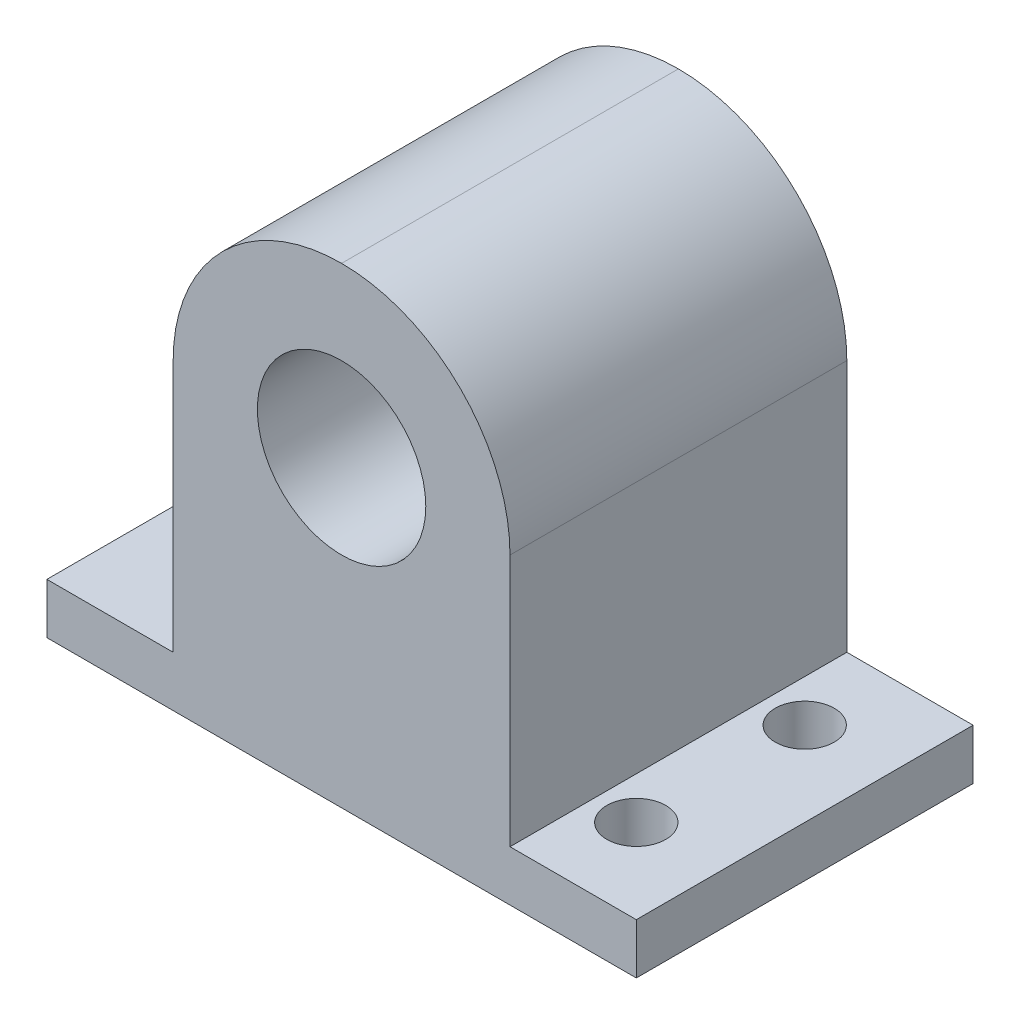
ISO-10303-21;
HEADER;
FILE_DESCRIPTION(('STEP AP214'),'2;1');
FILE_NAME('part.step','',(''),(''),'','','');
FILE_SCHEMA(('AUTOMOTIVE_DESIGN { 1 0 10303 214 1 1 1 1 }'));
ENDSEC;
DATA;
#1=APPLICATION_CONTEXT('core data for automotive mechanical design processes');
#2=APPLICATION_PROTOCOL_DEFINITION('international standard','automotive_design',2000,#1);
#3=PRODUCT_CONTEXT('',#1,'mechanical');
#4=PRODUCT('Part','Part','',(#3));
#5=PRODUCT_RELATED_PRODUCT_CATEGORY('part','',(#4));
#6=PRODUCT_DEFINITION_FORMATION('','',#4);
#7=PRODUCT_DEFINITION_CONTEXT('part definition',#1,'design');
#8=PRODUCT_DEFINITION('design','',#6,#7);
#9=PRODUCT_DEFINITION_SHAPE('','',#8);
#10=(LENGTH_UNIT() NAMED_UNIT(*) SI_UNIT(.MILLI.,.METRE.));
#11=(NAMED_UNIT(*) PLANE_ANGLE_UNIT() SI_UNIT($,.RADIAN.));
#12=(NAMED_UNIT(*) SI_UNIT($,.STERADIAN.) SOLID_ANGLE_UNIT());
#13=UNCERTAINTY_MEASURE_WITH_UNIT(LENGTH_MEASURE(1.E-05),#10,'distance_accuracy_value','');
#14=(GEOMETRIC_REPRESENTATION_CONTEXT(3) GLOBAL_UNCERTAINTY_ASSIGNED_CONTEXT((#13)) GLOBAL_UNIT_ASSIGNED_CONTEXT((#10,
#11,#12)) REPRESENTATION_CONTEXT('',''));
#15=CARTESIAN_POINT('',(0.,0.,0.));
#16=DIRECTION('',(0.,0.,1.));
#17=DIRECTION('',(1.,0.,0.));
#18=AXIS2_PLACEMENT_3D('',#15,#16,#17);
#19=CARTESIAN_POINT('',(0.,0.,20.));
#20=DIRECTION('',(0.,1.,0.));
#21=DIRECTION('',(0.,0.,1.));
#22=AXIS2_PLACEMENT_3D('',#19,#20,#21);
#23=PLANE('',#22);
#24=CARTESIAN_POINT('',(30.,0.,5.));
#25=DIRECTION('',(0.,1.,0.));
#26=DIRECTION('',(0.,0.,1.));
#27=AXIS2_PLACEMENT_3D('',#24,#25,#26);
#28=CIRCLE('',#27,1.75000000000001);
#29=CARTESIAN_POINT('',(30.,0.,6.75000000000001));
#30=VERTEX_POINT('',#29);
#31=EDGE_CURVE('E293',#30,#30,#28,.F.);
#32=ORIENTED_EDGE('',*,*,#31,.F.);
#33=EDGE_LOOP('',(#32));
#34=FACE_BOUND('',#33,.T.);
#35=CARTESIAN_POINT('',(5.,0.,15.));
#36=DIRECTION('',(0.,1.,0.));
#37=DIRECTION('',(0.,0.,1.));
#38=AXIS2_PLACEMENT_3D('',#35,#36,#37);
#39=CIRCLE('',#38,1.75);
#40=CARTESIAN_POINT('',(5.,0.,16.75));
#41=VERTEX_POINT('',#40);
#42=EDGE_CURVE('E290',#41,#41,#39,.F.);
#43=ORIENTED_EDGE('',*,*,#42,.F.);
#44=EDGE_LOOP('',(#43));
#45=FACE_BOUND('',#44,.T.);
#46=CARTESIAN_POINT('',(5.,0.,5.));
#47=DIRECTION('',(0.,1.,0.));
#48=DIRECTION('',(0.,0.,1.));
#49=AXIS2_PLACEMENT_3D('',#46,#47,#48);
#50=CIRCLE('',#49,1.75);
#51=CARTESIAN_POINT('',(5.,0.,6.75));
#52=VERTEX_POINT('',#51);
#53=EDGE_CURVE('E287',#52,#52,#50,.F.);
#54=ORIENTED_EDGE('',*,*,#53,.F.);
#55=EDGE_LOOP('',(#54));
#56=FACE_BOUND('',#55,.T.);
#57=CARTESIAN_POINT('',(30.,0.,15.));
#58=DIRECTION('',(0.,1.,0.));
#59=DIRECTION('',(0.,0.,1.));
#60=AXIS2_PLACEMENT_3D('',#57,#58,#59);
#61=CIRCLE('',#60,1.75000000000001);
#62=CARTESIAN_POINT('',(30.,0.,16.75));
#63=VERTEX_POINT('',#62);
#64=EDGE_CURVE('E307',#63,#63,#61,.F.);
#65=ORIENTED_EDGE('',*,*,#64,.F.);
#66=EDGE_LOOP('',(#65));
#67=FACE_BOUND('',#66,.T.);
#68=DIRECTION('',(1.,0.,0.));
#69=VECTOR('',#68,1.);
#70=CARTESIAN_POINT('',(0.,0.,0.));
#71=LINE('',#70,#69);
#72=CARTESIAN_POINT('',(0.,0.,0.));
#73=VERTEX_POINT('',#72);
#74=CARTESIAN_POINT('',(35.,0.,0.));
#75=VERTEX_POINT('',#74);
#76=EDGE_CURVE('E161',#73,#75,#71,.T.);
#77=ORIENTED_EDGE('',*,*,#76,.T.);
#78=DIRECTION('',(0.,0.,-1.));
#79=VECTOR('',#78,1.);
#80=CARTESIAN_POINT('',(35.,0.,20.));
#81=LINE('',#80,#79);
#82=CARTESIAN_POINT('',(35.,0.,20.));
#83=VERTEX_POINT('',#82);
#84=EDGE_CURVE('E143',#83,#75,#81,.T.);
#85=ORIENTED_EDGE('',*,*,#84,.F.);
#86=DIRECTION('',(1.,0.,0.));
#87=VECTOR('',#86,1.);
#88=CARTESIAN_POINT('',(0.,0.,20.));
#89=LINE('',#88,#87);
#90=CARTESIAN_POINT('',(0.,0.,20.));
#91=VERTEX_POINT('',#90);
#92=EDGE_CURVE('E149',#91,#83,#89,.T.);
#93=ORIENTED_EDGE('',*,*,#92,.F.);
#94=DIRECTION('',(0.,0.,-1.));
#95=VECTOR('',#94,1.);
#96=CARTESIAN_POINT('',(0.,0.,20.));
#97=LINE('',#96,#95);
#98=EDGE_CURVE('E211',#91,#73,#97,.T.);
#99=ORIENTED_EDGE('',*,*,#98,.T.);
#100=EDGE_LOOP('',(#77,#85,#93,#99));
#101=FACE_BOUND('',#100,.T.);
#102=ADVANCED_FACE('F67',(#34,#45,#56,#67,#101),#23,.F.);
#103=CARTESIAN_POINT('',(35.,0.,20.));
#104=DIRECTION('',(-1.,0.,0.));
#105=DIRECTION('',(0.,0.,1.));
#106=AXIS2_PLACEMENT_3D('',#103,#104,#105);
#107=PLANE('',#106);
#108=DIRECTION('',(0.,1.,0.));
#109=VECTOR('',#108,1.);
#110=CARTESIAN_POINT('',(35.,0.,0.));
#111=LINE('',#110,#109);
#112=CARTESIAN_POINT('',(35.,3.,0.));
#113=VERTEX_POINT('',#112);
#114=EDGE_CURVE('E215',#75,#113,#111,.T.);
#115=ORIENTED_EDGE('',*,*,#114,.T.);
#116=DIRECTION('',(0.,0.,-1.));
#117=VECTOR('',#116,1.);
#118=CARTESIAN_POINT('',(35.,3.,20.));
#119=LINE('',#118,#117);
#120=CARTESIAN_POINT('',(35.,3.,20.));
#121=VERTEX_POINT('',#120);
#122=EDGE_CURVE('E146',#121,#113,#119,.T.);
#123=ORIENTED_EDGE('',*,*,#122,.F.);
#124=DIRECTION('',(0.,1.,0.));
#125=VECTOR('',#124,1.);
#126=CARTESIAN_POINT('',(35.,0.,20.));
#127=LINE('',#126,#125);
#128=EDGE_CURVE('E138',#83,#121,#127,.T.);
#129=ORIENTED_EDGE('',*,*,#128,.F.);
#130=ORIENTED_EDGE('',*,*,#84,.T.);
#131=EDGE_LOOP('',(#115,#123,#129,#130));
#132=FACE_BOUND('',#131,.T.);
#133=ADVANCED_FACE('F141',(#132),#107,.F.);
#134=CARTESIAN_POINT('',(0.,0.,20.));
#135=DIRECTION('',(-1.,0.,0.));
#136=DIRECTION('',(0.,0.,1.));
#137=AXIS2_PLACEMENT_3D('',#134,#135,#136);
#138=PLANE('',#137);
#139=DIRECTION('',(0.,1.,0.));
#140=VECTOR('',#139,1.);
#141=CARTESIAN_POINT('',(0.,0.,0.));
#142=LINE('',#141,#140);
#143=CARTESIAN_POINT('',(0.,3.,0.));
#144=VERTEX_POINT('',#143);
#145=EDGE_CURVE('E158',#73,#144,#142,.T.);
#146=ORIENTED_EDGE('',*,*,#145,.F.);
#147=ORIENTED_EDGE('',*,*,#98,.F.);
#148=DIRECTION('',(0.,1.,0.));
#149=VECTOR('',#148,1.);
#150=CARTESIAN_POINT('',(0.,0.,20.));
#151=LINE('',#150,#149);
#152=CARTESIAN_POINT('',(0.,3.,20.));
#153=VERTEX_POINT('',#152);
#154=EDGE_CURVE('E156',#91,#153,#151,.T.);
#155=ORIENTED_EDGE('',*,*,#154,.T.);
#156=DIRECTION('',(0.,0.,-1.));
#157=VECTOR('',#156,1.);
#158=CARTESIAN_POINT('',(0.,3.,20.));
#159=LINE('',#158,#157);
#160=EDGE_CURVE('E166',#153,#144,#159,.T.);
#161=ORIENTED_EDGE('',*,*,#160,.T.);
#162=EDGE_LOOP('',(#146,#147,#155,#161));
#163=FACE_BOUND('',#162,.T.);
#164=ADVANCED_FACE('F224',(#163),#138,.T.);
#165=CARTESIAN_POINT('',(0.,0.,0.));
#166=DIRECTION('',(0.,0.,1.));
#167=DIRECTION('',(1.,0.,0.));
#168=AXIS2_PLACEMENT_3D('',#165,#166,#167);
#169=PLANE('',#168);
#170=CARTESIAN_POINT('',(17.5,18.,0.));
#171=DIRECTION('',(0.,0.,1.));
#172=DIRECTION('',(1.,0.,0.));
#173=AXIS2_PLACEMENT_3D('',#170,#171,#172);
#174=CIRCLE('',#173,5.);
#175=CARTESIAN_POINT('',(22.5,18.,0.));
#176=VERTEX_POINT('',#175);
#177=EDGE_CURVE('E179',#176,#176,#174,.F.);
#178=ORIENTED_EDGE('',*,*,#177,.F.);
#179=EDGE_LOOP('',(#178));
#180=FACE_BOUND('',#179,.T.);
#181=DIRECTION('',(0.,1.,0.));
#182=VECTOR('',#181,1.);
#183=CARTESIAN_POINT('',(7.5,3.,0.));
#184=LINE('',#183,#182);
#185=CARTESIAN_POINT('',(7.5,3.,0.));
#186=VERTEX_POINT('',#185);
#187=CARTESIAN_POINT('',(7.5,18.,0.));
#188=VERTEX_POINT('',#187);
#189=EDGE_CURVE('E176',#186,#188,#184,.T.);
#190=ORIENTED_EDGE('',*,*,#189,.T.);
#191=CARTESIAN_POINT('',(17.5,18.,0.));
#192=DIRECTION('',(0.,0.,1.));
#193=DIRECTION('',(1.,0.,0.));
#194=AXIS2_PLACEMENT_3D('',#191,#192,#193);
#195=CIRCLE('',#194,10.);
#196=CARTESIAN_POINT('',(17.5,28.,0.));
#197=VERTEX_POINT('',#196);
#198=EDGE_CURVE('E75',#188,#197,#195,.F.);
#199=ORIENTED_EDGE('',*,*,#198,.T.);
#200=CARTESIAN_POINT('',(17.5,18.,0.));
#201=DIRECTION('',(0.,0.,1.));
#202=DIRECTION('',(1.,0.,0.));
#203=AXIS2_PLACEMENT_3D('',#200,#201,#202);
#204=CIRCLE('',#203,10.);
#205=CARTESIAN_POINT('',(27.5,18.,0.));
#206=VERTEX_POINT('',#205);
#207=EDGE_CURVE('E185',#197,#206,#204,.F.);
#208=ORIENTED_EDGE('',*,*,#207,.T.);
#209=DIRECTION('',(0.,1.,0.));
#210=VECTOR('',#209,1.);
#211=CARTESIAN_POINT('',(27.5,3.,0.));
#212=LINE('',#211,#210);
#213=CARTESIAN_POINT('',(27.5,3.,0.));
#214=VERTEX_POINT('',#213);
#215=EDGE_CURVE('E173',#214,#206,#212,.T.);
#216=ORIENTED_EDGE('',*,*,#215,.F.);
#217=DIRECTION('',(1.,0.,0.));
#218=VECTOR('',#217,1.);
#219=CARTESIAN_POINT('',(0.,3.,0.));
#220=LINE('',#219,#218);
#221=EDGE_CURVE('E217',#214,#113,#220,.T.);
#222=ORIENTED_EDGE('',*,*,#221,.T.);
#223=ORIENTED_EDGE('',*,*,#114,.F.);
#224=ORIENTED_EDGE('',*,*,#76,.F.);
#225=ORIENTED_EDGE('',*,*,#145,.T.);
#226=EDGE_CURVE('E218',#144,#186,#220,.T.);
#227=ORIENTED_EDGE('',*,*,#226,.T.);
#228=EDGE_LOOP('',(#190,#199,#208,#216,#222,#223,#224,#225,#227));
#229=FACE_BOUND('',#228,.T.);
#230=ADVANCED_FACE('F194',(#180,#229),#169,.F.);
#231=CARTESIAN_POINT('',(0.,0.,20.));
#232=DIRECTION('',(0.,0.,1.));
#233=DIRECTION('',(1.,0.,0.));
#234=AXIS2_PLACEMENT_3D('',#231,#232,#233);
#235=PLANE('',#234);
#236=CARTESIAN_POINT('',(17.5,18.,20.));
#237=DIRECTION('',(0.,0.,1.));
#238=DIRECTION('',(1.,0.,0.));
#239=AXIS2_PLACEMENT_3D('',#236,#237,#238);
#240=CIRCLE('',#239,5.);
#241=CARTESIAN_POINT('',(22.5,18.,20.));
#242=VERTEX_POINT('',#241);
#243=EDGE_CURVE('E310',#242,#242,#240,.T.);
#244=ORIENTED_EDGE('',*,*,#243,.F.);
#245=EDGE_LOOP('',(#244));
#246=FACE_BOUND('',#245,.T.);
#247=CARTESIAN_POINT('',(17.5,18.,20.));
#248=DIRECTION('',(0.,0.,1.));
#249=DIRECTION('',(1.,0.,0.));
#250=AXIS2_PLACEMENT_3D('',#247,#248,#249);
#251=CIRCLE('',#250,10.);
#252=CARTESIAN_POINT('',(27.5,18.,20.));
#253=VERTEX_POINT('',#252);
#254=CARTESIAN_POINT('',(17.5,28.,20.));
#255=VERTEX_POINT('',#254);
#256=EDGE_CURVE('E189',#253,#255,#251,.T.);
#257=ORIENTED_EDGE('',*,*,#256,.T.);
#258=CARTESIAN_POINT('',(17.5,18.,20.));
#259=DIRECTION('',(0.,0.,1.));
#260=DIRECTION('',(1.,0.,0.));
#261=AXIS2_PLACEMENT_3D('',#258,#259,#260);
#262=CIRCLE('',#261,10.);
#263=CARTESIAN_POINT('',(7.5,18.,20.));
#264=VERTEX_POINT('',#263);
#265=EDGE_CURVE('E12',#255,#264,#262,.T.);
#266=ORIENTED_EDGE('',*,*,#265,.T.);
#267=DIRECTION('',(0.,1.,0.));
#268=VECTOR('',#267,1.);
#269=CARTESIAN_POINT('',(7.5,3.,20.));
#270=LINE('',#269,#268);
#271=CARTESIAN_POINT('',(7.5,3.,20.));
#272=VERTEX_POINT('',#271);
#273=EDGE_CURVE('E170',#272,#264,#270,.T.);
#274=ORIENTED_EDGE('',*,*,#273,.F.);
#275=DIRECTION('',(1.,0.,0.));
#276=VECTOR('',#275,1.);
#277=CARTESIAN_POINT('',(0.,3.,20.));
#278=LINE('',#277,#276);
#279=EDGE_CURVE('E206',#153,#272,#278,.T.);
#280=ORIENTED_EDGE('',*,*,#279,.F.);
#281=ORIENTED_EDGE('',*,*,#154,.F.);
#282=ORIENTED_EDGE('',*,*,#92,.T.);
#283=ORIENTED_EDGE('',*,*,#128,.T.);
#284=CARTESIAN_POINT('',(27.5,3.,20.));
#285=VERTEX_POINT('',#284);
#286=EDGE_CURVE('E148',#285,#121,#278,.T.);
#287=ORIENTED_EDGE('',*,*,#286,.F.);
#288=DIRECTION('',(0.,1.,0.));
#289=VECTOR('',#288,1.);
#290=CARTESIAN_POINT('',(27.5,3.,20.));
#291=LINE('',#290,#289);
#292=EDGE_CURVE('E172',#285,#253,#291,.T.);
#293=ORIENTED_EDGE('',*,*,#292,.T.);
#294=EDGE_LOOP('',(#257,#266,#274,#280,#281,#282,#283,#287,#293));
#295=FACE_BOUND('',#294,.T.);
#296=ADVANCED_FACE('F153',(#246,#295),#235,.T.);
#297=CARTESIAN_POINT('',(0.,3.,20.));
#298=DIRECTION('',(0.,1.,0.));
#299=DIRECTION('',(0.,0.,1.));
#300=AXIS2_PLACEMENT_3D('',#297,#298,#299);
#301=PLANE('',#300);
#302=CARTESIAN_POINT('',(5.,3.,15.));
#303=DIRECTION('',(0.,1.,0.));
#304=DIRECTION('',(0.,0.,1.));
#305=AXIS2_PLACEMENT_3D('',#302,#303,#304);
#306=CIRCLE('',#305,1.75);
#307=CARTESIAN_POINT('',(5.,3.,16.75));
#308=VERTEX_POINT('',#307);
#309=EDGE_CURVE('E297',#308,#308,#306,.T.);
#310=ORIENTED_EDGE('',*,*,#309,.F.);
#311=EDGE_LOOP('',(#310));
#312=FACE_BOUND('',#311,.T.);
#313=CARTESIAN_POINT('',(5.,3.,5.));
#314=DIRECTION('',(0.,1.,0.));
#315=DIRECTION('',(0.,0.,1.));
#316=AXIS2_PLACEMENT_3D('',#313,#314,#315);
#317=CIRCLE('',#316,1.75);
#318=CARTESIAN_POINT('',(5.,3.,6.75));
#319=VERTEX_POINT('',#318);
#320=EDGE_CURVE('E284',#319,#319,#317,.T.);
#321=ORIENTED_EDGE('',*,*,#320,.F.);
#322=EDGE_LOOP('',(#321));
#323=FACE_BOUND('',#322,.T.);
#324=ORIENTED_EDGE('',*,*,#279,.T.);
#325=DIRECTION('',(0.,0.,-1.));
#326=VECTOR('',#325,1.);
#327=CARTESIAN_POINT('',(7.5,3.,20.));
#328=LINE('',#327,#326);
#329=EDGE_CURVE('E162',#272,#186,#328,.T.);
#330=ORIENTED_EDGE('',*,*,#329,.T.);
#331=ORIENTED_EDGE('',*,*,#226,.F.);
#332=ORIENTED_EDGE('',*,*,#160,.F.);
#333=EDGE_LOOP('',(#324,#330,#331,#332));
#334=FACE_BOUND('',#333,.T.);
#335=ADVANCED_FACE('F208',(#312,#323,#334),#301,.T.);
#336=CARTESIAN_POINT('',(30.,3.,5.));
#337=DIRECTION('',(0.,1.,0.));
#338=DIRECTION('',(0.,0.,1.));
#339=AXIS2_PLACEMENT_3D('',#336,#337,#338);
#340=CIRCLE('',#339,1.75000000000001);
#341=CARTESIAN_POINT('',(30.,3.,6.75000000000001));
#342=VERTEX_POINT('',#341);
#343=EDGE_CURVE('E296',#342,#342,#340,.T.);
#344=ORIENTED_EDGE('',*,*,#343,.F.);
#345=EDGE_LOOP('',(#344));
#346=FACE_BOUND('',#345,.T.);
#347=CARTESIAN_POINT('',(30.,3.,15.));
#348=DIRECTION('',(0.,1.,0.));
#349=DIRECTION('',(0.,0.,1.));
#350=AXIS2_PLACEMENT_3D('',#347,#348,#349);
#351=CIRCLE('',#350,1.75000000000001);
#352=CARTESIAN_POINT('',(30.,3.,16.75));
#353=VERTEX_POINT('',#352);
#354=EDGE_CURVE('E300',#353,#353,#351,.T.);
#355=ORIENTED_EDGE('',*,*,#354,.F.);
#356=EDGE_LOOP('',(#355));
#357=FACE_BOUND('',#356,.T.);
#358=DIRECTION('',(0.,0.,-1.));
#359=VECTOR('',#358,1.);
#360=CARTESIAN_POINT('',(27.5,3.,20.));
#361=LINE('',#360,#359);
#362=EDGE_CURVE('E164',#285,#214,#361,.T.);
#363=ORIENTED_EDGE('',*,*,#362,.F.);
#364=ORIENTED_EDGE('',*,*,#286,.T.);
#365=ORIENTED_EDGE('',*,*,#122,.T.);
#366=ORIENTED_EDGE('',*,*,#221,.F.);
#367=EDGE_LOOP('',(#363,#364,#365,#366));
#368=FACE_BOUND('',#367,.T.);
#369=ADVANCED_FACE('F227',(#346,#357,#368),#301,.T.);
#370=CARTESIAN_POINT('',(7.5,3.,20.));
#371=DIRECTION('',(-1.,0.,0.));
#372=DIRECTION('',(0.,0.,1.));
#373=AXIS2_PLACEMENT_3D('',#370,#371,#372);
#374=PLANE('',#373);
#375=ORIENTED_EDGE('',*,*,#273,.T.);
#376=DIRECTION('',(0.,0.,-1.));
#377=VECTOR('',#376,1.);
#378=CARTESIAN_POINT('',(7.5,18.,20.));
#379=LINE('',#378,#377);
#380=EDGE_CURVE('E191',#264,#188,#379,.T.);
#381=ORIENTED_EDGE('',*,*,#380,.T.);
#382=ORIENTED_EDGE('',*,*,#189,.F.);
#383=ORIENTED_EDGE('',*,*,#329,.F.);
#384=EDGE_LOOP('',(#375,#381,#382,#383));
#385=FACE_BOUND('',#384,.T.);
#386=ADVANCED_FACE('F204',(#385),#374,.T.);
#387=CARTESIAN_POINT('',(27.5,3.,20.));
#388=DIRECTION('',(-1.,0.,0.));
#389=DIRECTION('',(0.,0.,1.));
#390=AXIS2_PLACEMENT_3D('',#387,#388,#389);
#391=PLANE('',#390);
#392=ORIENTED_EDGE('',*,*,#215,.T.);
#393=DIRECTION('',(0.,0.,-1.));
#394=VECTOR('',#393,1.);
#395=CARTESIAN_POINT('',(27.5,18.,20.));
#396=LINE('',#395,#394);
#397=EDGE_CURVE('E187',#206,#253,#396,.F.);
#398=ORIENTED_EDGE('',*,*,#397,.T.);
#399=ORIENTED_EDGE('',*,*,#292,.F.);
#400=ORIENTED_EDGE('',*,*,#362,.T.);
#401=EDGE_LOOP('',(#392,#398,#399,#400));
#402=FACE_BOUND('',#401,.T.);
#403=ADVANCED_FACE('F230',(#402),#391,.F.);
#404=CARTESIAN_POINT('',(17.5,18.,20.));
#405=DIRECTION('',(0.,0.,1.));
#406=DIRECTION('',(1.,0.,0.));
#407=AXIS2_PLACEMENT_3D('',#404,#405,#406);
#408=CYLINDRICAL_SURFACE('',#407,10.);
#409=ORIENTED_EDGE('',*,*,#256,.F.);
#410=ORIENTED_EDGE('',*,*,#397,.F.);
#411=ORIENTED_EDGE('',*,*,#207,.F.);
#412=DIRECTION('',(0.,0.,-1.));
#413=VECTOR('',#412,1.);
#414=CARTESIAN_POINT('',(17.5,28.,0.));
#415=LINE('',#414,#413);
#416=EDGE_CURVE('E183',#255,#197,#415,.T.);
#417=ORIENTED_EDGE('',*,*,#416,.F.);
#418=EDGE_LOOP('',(#409,#410,#411,#417));
#419=FACE_BOUND('',#418,.T.);
#420=ADVANCED_FACE('F202',(#419),#408,.T.);
#421=CARTESIAN_POINT('',(17.5,18.,20.));
#422=DIRECTION('',(0.,0.,-1.));
#423=DIRECTION('',(-1.,0.,0.));
#424=AXIS2_PLACEMENT_3D('',#421,#422,#423);
#425=CYLINDRICAL_SURFACE('',#424,10.);
#426=ORIENTED_EDGE('',*,*,#265,.F.);
#427=ORIENTED_EDGE('',*,*,#416,.T.);
#428=ORIENTED_EDGE('',*,*,#198,.F.);
#429=ORIENTED_EDGE('',*,*,#380,.F.);
#430=EDGE_LOOP('',(#426,#427,#428,#429));
#431=FACE_BOUND('',#430,.T.);
#432=ADVANCED_FACE('F69',(#431),#425,.T.);
#433=CARTESIAN_POINT('',(17.5,18.,-0.001000000000001));
#434=DIRECTION('',(0.,0.,1.));
#435=DIRECTION('',(1.,0.,0.));
#436=AXIS2_PLACEMENT_3D('',#433,#434,#435);
#437=CYLINDRICAL_SURFACE('',#436,5.);
#438=ORIENTED_EDGE('',*,*,#243,.T.);
#439=EDGE_LOOP('',(#438));
#440=FACE_BOUND('',#439,.T.);
#441=ORIENTED_EDGE('',*,*,#177,.T.);
#442=EDGE_LOOP('',(#441));
#443=FACE_BOUND('',#442,.T.);
#444=ADVANCED_FACE('F261',(#440,#443),#437,.F.);
#445=CARTESIAN_POINT('',(30.,-0.00100000000000013,15.));
#446=DIRECTION('',(0.,1.,0.));
#447=DIRECTION('',(0.,0.,1.));
#448=AXIS2_PLACEMENT_3D('',#445,#446,#447);
#449=CYLINDRICAL_SURFACE('',#448,1.75000000000001);
#450=CARTESIAN_POINT('',(30.,3.,16.75));
#451=CARTESIAN_POINT('',(30.,2.96875,16.75));
#452=CARTESIAN_POINT('',(30.,2.9375,16.75));
#453=CARTESIAN_POINT('',(30.,2.875,16.75));
#454=CARTESIAN_POINT('',(30.,2.84375,16.75));
#455=CARTESIAN_POINT('',(30.,2.78125,16.75));
#456=CARTESIAN_POINT('',(30.,2.75,16.75));
#457=CARTESIAN_POINT('',(30.,2.6875,16.75));
#458=CARTESIAN_POINT('',(30.,2.65625,16.75));
#459=CARTESIAN_POINT('',(30.,2.59375,16.75));
#460=CARTESIAN_POINT('',(30.,2.5625,16.75));
#461=CARTESIAN_POINT('',(30.,2.5,16.75));
#462=CARTESIAN_POINT('',(30.,2.46875,16.75));
#463=CARTESIAN_POINT('',(30.,2.40625,16.75));
#464=CARTESIAN_POINT('',(30.,2.375,16.75));
#465=CARTESIAN_POINT('',(30.,2.3125,16.75));
#466=CARTESIAN_POINT('',(30.,2.28125,16.75));
#467=CARTESIAN_POINT('',(30.,2.21875,16.75));
#468=CARTESIAN_POINT('',(30.,2.1875,16.75));
#469=CARTESIAN_POINT('',(30.,2.125,16.75));
#470=CARTESIAN_POINT('',(30.,2.09375,16.75));
#471=CARTESIAN_POINT('',(30.,2.03125,16.75));
#472=CARTESIAN_POINT('',(30.,2.,16.75));
#473=CARTESIAN_POINT('',(30.,1.9375,16.75));
#474=CARTESIAN_POINT('',(30.,1.90625,16.75));
#475=CARTESIAN_POINT('',(30.,1.84375,16.75));
#476=CARTESIAN_POINT('',(30.,1.8125,16.75));
#477=CARTESIAN_POINT('',(30.,1.75,16.75));
#478=CARTESIAN_POINT('',(30.,1.71875,16.75));
#479=CARTESIAN_POINT('',(30.,1.65625,16.75));
#480=CARTESIAN_POINT('',(30.,1.625,16.75));
#481=CARTESIAN_POINT('',(30.,1.5625,16.75));
#482=CARTESIAN_POINT('',(30.,1.53125,16.75));
#483=CARTESIAN_POINT('',(30.,1.46875,16.75));
#484=CARTESIAN_POINT('',(30.,1.4375,16.75));
#485=CARTESIAN_POINT('',(30.,1.375,16.75));
#486=CARTESIAN_POINT('',(30.,1.34375,16.75));
#487=CARTESIAN_POINT('',(30.,1.28125,16.75));
#488=CARTESIAN_POINT('',(30.,1.25,16.75));
#489=CARTESIAN_POINT('',(30.,1.1875,16.75));
#490=CARTESIAN_POINT('',(30.,1.15625,16.75));
#491=CARTESIAN_POINT('',(30.,1.09375,16.75));
#492=CARTESIAN_POINT('',(30.,1.0625,16.75));
#493=CARTESIAN_POINT('',(30.,1.,16.75));
#494=CARTESIAN_POINT('',(30.,0.96875,16.75));
#495=CARTESIAN_POINT('',(30.,0.90625,16.75));
#496=CARTESIAN_POINT('',(30.,0.875,16.75));
#497=CARTESIAN_POINT('',(30.,0.8125,16.75));
#498=CARTESIAN_POINT('',(30.,0.78125,16.75));
#499=CARTESIAN_POINT('',(30.,0.71875,16.75));
#500=CARTESIAN_POINT('',(30.,0.6875,16.75));
#501=CARTESIAN_POINT('',(30.,0.625,16.75));
#502=CARTESIAN_POINT('',(30.,0.59375,16.75));
#503=CARTESIAN_POINT('',(30.,0.53125,16.75));
#504=CARTESIAN_POINT('',(30.,0.5,16.75));
#505=CARTESIAN_POINT('',(30.,0.4375,16.75));
#506=CARTESIAN_POINT('',(30.,0.40625,16.75));
#507=CARTESIAN_POINT('',(30.,0.34375,16.75));
#508=CARTESIAN_POINT('',(30.,0.3125,16.75));
#509=CARTESIAN_POINT('',(30.,0.25,16.75));
#510=CARTESIAN_POINT('',(30.,0.21875,16.75));
#511=CARTESIAN_POINT('',(30.,0.15625,16.75));
#512=CARTESIAN_POINT('',(30.,0.125,16.75));
#513=CARTESIAN_POINT('',(30.,0.0625000000000001,16.75));
#514=CARTESIAN_POINT('',(30.,0.0312500000000001,16.75));
#515=CARTESIAN_POINT('',(30.,0.,16.75));
#516=B_SPLINE_CURVE_WITH_KNOTS('',3,(#450,#451,#452,#453,#454,#455,#456,#457,#458,#459,#460,
#461,#462,#463,#464,#465,#466,#467,#468,#469,#470,#471,#472,#473,#474,#475,#476,#477,#478,#479,
#480,#481,#482,#483,#484,#485,#486,#487,#488,#489,#490,#491,#492,#493,#494,#495,#496,#497,#498,
#499,#500,#501,#502,#503,#504,#505,#506,#507,#508,#509,#510,#511,#512,#513,#514,#515),
.UNSPECIFIED.,.F.,.F.,(4,2,2,2,2,2,2,2,2,2,2,2,2,2,2,2,2,2,2,2,2,2,2,2,2,2,2,2,2,2,2,2,4),(0.,
0.0937500000000001,0.1875,0.28125,0.375,0.46875,0.5625,0.65625,0.75,0.84375,0.9375,1.03125,
1.125,1.21875,1.3125,1.40625,1.5,1.59375,1.6875,1.78125,1.875,1.96875,2.0625,2.15625,2.25,
2.34375,2.4375,2.53125,2.625,2.71875,2.8125,2.90625,3.),.UNSPECIFIED.);
#517=EDGE_CURVE('BSEAM263',#353,#63,#516,.T.);
#518=ORIENTED_EDGE('',*,*,#354,.T.);
#519=ORIENTED_EDGE('',*,*,#64,.T.);
#520=ORIENTED_EDGE('',*,*,#517,.T.);
#521=ORIENTED_EDGE('',*,*,#517,.F.);
#522=EDGE_LOOP('',(#518,#520,#519,#521));
#523=FACE_BOUND('',#522,.T.);
#524=ADVANCED_FACE('F263',(#523),#449,.F.);
#525=CARTESIAN_POINT('',(30.,-0.00100000000000013,5.));
#526=DIRECTION('',(0.,1.,0.));
#527=DIRECTION('',(0.,0.,1.));
#528=AXIS2_PLACEMENT_3D('',#525,#526,#527);
#529=CYLINDRICAL_SURFACE('',#528,1.75000000000001);
#530=CARTESIAN_POINT('',(30.,3.,6.75000000000001));
#531=CARTESIAN_POINT('',(30.,2.96875,6.75000000000001));
#532=CARTESIAN_POINT('',(30.,2.9375,6.75000000000001));
#533=CARTESIAN_POINT('',(30.,2.875,6.75000000000001));
#534=CARTESIAN_POINT('',(30.,2.84375,6.75000000000001));
#535=CARTESIAN_POINT('',(30.,2.78125,6.75000000000001));
#536=CARTESIAN_POINT('',(30.,2.75,6.75000000000001));
#537=CARTESIAN_POINT('',(30.,2.6875,6.75000000000001));
#538=CARTESIAN_POINT('',(30.,2.65625,6.75000000000001));
#539=CARTESIAN_POINT('',(30.,2.59375,6.75000000000001));
#540=CARTESIAN_POINT('',(30.,2.5625,6.75000000000001));
#541=CARTESIAN_POINT('',(30.,2.5,6.75000000000001));
#542=CARTESIAN_POINT('',(30.,2.46875,6.75000000000001));
#543=CARTESIAN_POINT('',(30.,2.40625,6.75000000000001));
#544=CARTESIAN_POINT('',(30.,2.375,6.75000000000001));
#545=CARTESIAN_POINT('',(30.,2.3125,6.75000000000001));
#546=CARTESIAN_POINT('',(30.,2.28125,6.75000000000001));
#547=CARTESIAN_POINT('',(30.,2.21875,6.75000000000001));
#548=CARTESIAN_POINT('',(30.,2.1875,6.75000000000001));
#549=CARTESIAN_POINT('',(30.,2.125,6.75000000000001));
#550=CARTESIAN_POINT('',(30.,2.09375,6.75000000000001));
#551=CARTESIAN_POINT('',(30.,2.03125,6.75000000000001));
#552=CARTESIAN_POINT('',(30.,2.,6.75000000000001));
#553=CARTESIAN_POINT('',(30.,1.9375,6.75000000000001));
#554=CARTESIAN_POINT('',(30.,1.90625,6.75000000000001));
#555=CARTESIAN_POINT('',(30.,1.84375,6.75000000000001));
#556=CARTESIAN_POINT('',(30.,1.8125,6.75000000000001));
#557=CARTESIAN_POINT('',(30.,1.75,6.75000000000001));
#558=CARTESIAN_POINT('',(30.,1.71875,6.75000000000001));
#559=CARTESIAN_POINT('',(30.,1.65625,6.75000000000001));
#560=CARTESIAN_POINT('',(30.,1.625,6.75000000000001));
#561=CARTESIAN_POINT('',(30.,1.5625,6.75000000000001));
#562=CARTESIAN_POINT('',(30.,1.53125,6.75000000000001));
#563=CARTESIAN_POINT('',(30.,1.46875,6.75000000000001));
#564=CARTESIAN_POINT('',(30.,1.4375,6.75000000000001));
#565=CARTESIAN_POINT('',(30.,1.375,6.75000000000001));
#566=CARTESIAN_POINT('',(30.,1.34375,6.75000000000001));
#567=CARTESIAN_POINT('',(30.,1.28125,6.75000000000001));
#568=CARTESIAN_POINT('',(30.,1.25,6.75000000000001));
#569=CARTESIAN_POINT('',(30.,1.1875,6.75000000000001));
#570=CARTESIAN_POINT('',(30.,1.15625,6.75000000000001));
#571=CARTESIAN_POINT('',(30.,1.09375,6.75000000000001));
#572=CARTESIAN_POINT('',(30.,1.0625,6.75000000000001));
#573=CARTESIAN_POINT('',(30.,1.,6.75000000000001));
#574=CARTESIAN_POINT('',(30.,0.96875,6.75000000000001));
#575=CARTESIAN_POINT('',(30.,0.90625,6.75000000000001));
#576=CARTESIAN_POINT('',(30.,0.875,6.75000000000001));
#577=CARTESIAN_POINT('',(30.,0.8125,6.75000000000001));
#578=CARTESIAN_POINT('',(30.,0.78125,6.75000000000001));
#579=CARTESIAN_POINT('',(30.,0.71875,6.75000000000001));
#580=CARTESIAN_POINT('',(30.,0.6875,6.75000000000001));
#581=CARTESIAN_POINT('',(30.,0.625,6.75000000000001));
#582=CARTESIAN_POINT('',(30.,0.59375,6.75000000000001));
#583=CARTESIAN_POINT('',(30.,0.53125,6.75000000000001));
#584=CARTESIAN_POINT('',(30.,0.5,6.75000000000001));
#585=CARTESIAN_POINT('',(30.,0.4375,6.75000000000001));
#586=CARTESIAN_POINT('',(30.,0.40625,6.75000000000001));
#587=CARTESIAN_POINT('',(30.,0.34375,6.75000000000001));
#588=CARTESIAN_POINT('',(30.,0.3125,6.75000000000001));
#589=CARTESIAN_POINT('',(30.,0.25,6.75000000000001));
#590=CARTESIAN_POINT('',(30.,0.21875,6.75000000000001));
#591=CARTESIAN_POINT('',(30.,0.15625,6.75000000000001));
#592=CARTESIAN_POINT('',(30.,0.125,6.75000000000001));
#593=CARTESIAN_POINT('',(30.,0.0625000000000001,6.75000000000001));
#594=CARTESIAN_POINT('',(30.,0.0312500000000001,6.75000000000001));
#595=CARTESIAN_POINT('',(30.,0.,6.75000000000001));
#596=B_SPLINE_CURVE_WITH_KNOTS('',3,(#530,#531,#532,#533,#534,#535,#536,#537,#538,#539,#540,
#541,#542,#543,#544,#545,#546,#547,#548,#549,#550,#551,#552,#553,#554,#555,#556,#557,#558,#559,
#560,#561,#562,#563,#564,#565,#566,#567,#568,#569,#570,#571,#572,#573,#574,#575,#576,#577,#578,
#579,#580,#581,#582,#583,#584,#585,#586,#587,#588,#589,#590,#591,#592,#593,#594,#595),
.UNSPECIFIED.,.F.,.F.,(4,2,2,2,2,2,2,2,2,2,2,2,2,2,2,2,2,2,2,2,2,2,2,2,2,2,2,2,2,2,2,2,4),(0.,
0.0937500000000001,0.1875,0.28125,0.375,0.46875,0.5625,0.65625,0.75,0.84375,0.9375,1.03125,
1.125,1.21875,1.3125,1.40625,1.5,1.59375,1.6875,1.78125,1.875,1.96875,2.0625,2.15625,2.25,
2.34375,2.4375,2.53125,2.625,2.71875,2.8125,2.90625,3.),.UNSPECIFIED.);
#597=EDGE_CURVE('BSEAM267',#342,#30,#596,.T.);
#598=ORIENTED_EDGE('',*,*,#343,.T.);
#599=ORIENTED_EDGE('',*,*,#31,.T.);
#600=ORIENTED_EDGE('',*,*,#597,.T.);
#601=ORIENTED_EDGE('',*,*,#597,.F.);
#602=EDGE_LOOP('',(#598,#600,#599,#601));
#603=FACE_BOUND('',#602,.T.);
#604=ADVANCED_FACE('F267',(#603),#529,.F.);
#605=CARTESIAN_POINT('',(5.,-0.00100000000000013,5.));
#606=DIRECTION('',(0.,1.,0.));
#607=DIRECTION('',(0.,0.,1.));
#608=AXIS2_PLACEMENT_3D('',#605,#606,#607);
#609=CYLINDRICAL_SURFACE('',#608,1.75);
#610=CARTESIAN_POINT('',(5.,3.,6.75));
#611=CARTESIAN_POINT('',(5.,2.96875,6.75));
#612=CARTESIAN_POINT('',(5.,2.9375,6.75));
#613=CARTESIAN_POINT('',(5.,2.875,6.75));
#614=CARTESIAN_POINT('',(5.,2.84375,6.75));
#615=CARTESIAN_POINT('',(5.,2.78125,6.75));
#616=CARTESIAN_POINT('',(5.,2.75,6.75));
#617=CARTESIAN_POINT('',(5.,2.6875,6.75));
#618=CARTESIAN_POINT('',(5.,2.65625,6.75));
#619=CARTESIAN_POINT('',(5.,2.59375,6.75));
#620=CARTESIAN_POINT('',(5.,2.5625,6.75));
#621=CARTESIAN_POINT('',(5.,2.5,6.75));
#622=CARTESIAN_POINT('',(5.,2.46875,6.75));
#623=CARTESIAN_POINT('',(5.,2.40625,6.75));
#624=CARTESIAN_POINT('',(5.,2.375,6.75));
#625=CARTESIAN_POINT('',(5.,2.3125,6.75));
#626=CARTESIAN_POINT('',(5.,2.28125,6.75));
#627=CARTESIAN_POINT('',(5.,2.21875,6.75));
#628=CARTESIAN_POINT('',(5.,2.1875,6.75));
#629=CARTESIAN_POINT('',(5.,2.125,6.75));
#630=CARTESIAN_POINT('',(5.,2.09375,6.75));
#631=CARTESIAN_POINT('',(5.,2.03125,6.75));
#632=CARTESIAN_POINT('',(5.,2.,6.75));
#633=CARTESIAN_POINT('',(5.,1.9375,6.75));
#634=CARTESIAN_POINT('',(5.,1.90625,6.75));
#635=CARTESIAN_POINT('',(5.,1.84375,6.75));
#636=CARTESIAN_POINT('',(5.,1.8125,6.75));
#637=CARTESIAN_POINT('',(5.,1.75,6.75));
#638=CARTESIAN_POINT('',(5.,1.71875,6.75));
#639=CARTESIAN_POINT('',(5.,1.65625,6.75));
#640=CARTESIAN_POINT('',(5.,1.625,6.75));
#641=CARTESIAN_POINT('',(5.,1.5625,6.75));
#642=CARTESIAN_POINT('',(5.,1.53125,6.75));
#643=CARTESIAN_POINT('',(5.,1.46875,6.75));
#644=CARTESIAN_POINT('',(5.,1.4375,6.75));
#645=CARTESIAN_POINT('',(5.,1.375,6.75));
#646=CARTESIAN_POINT('',(5.,1.34375,6.75));
#647=CARTESIAN_POINT('',(5.,1.28125,6.75));
#648=CARTESIAN_POINT('',(5.,1.25,6.75));
#649=CARTESIAN_POINT('',(5.,1.1875,6.75));
#650=CARTESIAN_POINT('',(5.,1.15625,6.75));
#651=CARTESIAN_POINT('',(5.,1.09375,6.75));
#652=CARTESIAN_POINT('',(5.,1.0625,6.75));
#653=CARTESIAN_POINT('',(5.,1.,6.75));
#654=CARTESIAN_POINT('',(5.,0.96875,6.75));
#655=CARTESIAN_POINT('',(5.,0.90625,6.75));
#656=CARTESIAN_POINT('',(5.,0.875,6.75));
#657=CARTESIAN_POINT('',(5.,0.8125,6.75));
#658=CARTESIAN_POINT('',(5.,0.78125,6.75));
#659=CARTESIAN_POINT('',(5.,0.71875,6.75));
#660=CARTESIAN_POINT('',(5.,0.6875,6.75));
#661=CARTESIAN_POINT('',(5.,0.625,6.75));
#662=CARTESIAN_POINT('',(5.,0.59375,6.75));
#663=CARTESIAN_POINT('',(5.,0.53125,6.75));
#664=CARTESIAN_POINT('',(5.,0.5,6.75));
#665=CARTESIAN_POINT('',(5.,0.4375,6.75));
#666=CARTESIAN_POINT('',(5.,0.40625,6.75));
#667=CARTESIAN_POINT('',(5.,0.34375,6.75));
#668=CARTESIAN_POINT('',(5.,0.3125,6.75));
#669=CARTESIAN_POINT('',(5.,0.25,6.75));
#670=CARTESIAN_POINT('',(5.,0.21875,6.75));
#671=CARTESIAN_POINT('',(5.,0.15625,6.75));
#672=CARTESIAN_POINT('',(5.,0.125,6.75));
#673=CARTESIAN_POINT('',(5.,0.0625000000000001,6.75));
#674=CARTESIAN_POINT('',(5.,0.0312500000000001,6.75));
#675=CARTESIAN_POINT('',(5.,0.,6.75));
#676=B_SPLINE_CURVE_WITH_KNOTS('',3,(#610,#611,#612,#613,#614,#615,#616,#617,#618,#619,#620,
#621,#622,#623,#624,#625,#626,#627,#628,#629,#630,#631,#632,#633,#634,#635,#636,#637,#638,#639,
#640,#641,#642,#643,#644,#645,#646,#647,#648,#649,#650,#651,#652,#653,#654,#655,#656,#657,#658,
#659,#660,#661,#662,#663,#664,#665,#666,#667,#668,#669,#670,#671,#672,#673,#674,#675),
.UNSPECIFIED.,.F.,.F.,(4,2,2,2,2,2,2,2,2,2,2,2,2,2,2,2,2,2,2,2,2,2,2,2,2,2,2,2,2,2,2,2,4),(0.,
0.0937500000000001,0.1875,0.28125,0.375,0.46875,0.5625,0.65625,0.75,0.84375,0.9375,1.03125,
1.125,1.21875,1.3125,1.40625,1.5,1.59375,1.6875,1.78125,1.875,1.96875,2.0625,2.15625,2.25,
2.34375,2.4375,2.53125,2.625,2.71875,2.8125,2.90625,3.),.UNSPECIFIED.);
#677=EDGE_CURVE('BSEAM272',#319,#52,#676,.T.);
#678=ORIENTED_EDGE('',*,*,#320,.T.);
#679=ORIENTED_EDGE('',*,*,#53,.T.);
#680=ORIENTED_EDGE('',*,*,#677,.T.);
#681=ORIENTED_EDGE('',*,*,#677,.F.);
#682=EDGE_LOOP('',(#678,#680,#679,#681));
#683=FACE_BOUND('',#682,.T.);
#684=ADVANCED_FACE('F272',(#683),#609,.F.);
#685=CARTESIAN_POINT('',(5.,-0.00100000000000013,15.));
#686=DIRECTION('',(0.,1.,0.));
#687=DIRECTION('',(0.,0.,1.));
#688=AXIS2_PLACEMENT_3D('',#685,#686,#687);
#689=CYLINDRICAL_SURFACE('',#688,1.75);
#690=CARTESIAN_POINT('',(5.,3.,16.75));
#691=CARTESIAN_POINT('',(5.,2.96875,16.75));
#692=CARTESIAN_POINT('',(5.,2.9375,16.75));
#693=CARTESIAN_POINT('',(5.,2.875,16.75));
#694=CARTESIAN_POINT('',(5.,2.84375,16.75));
#695=CARTESIAN_POINT('',(5.,2.78125,16.75));
#696=CARTESIAN_POINT('',(5.,2.75,16.75));
#697=CARTESIAN_POINT('',(5.,2.6875,16.75));
#698=CARTESIAN_POINT('',(5.,2.65625,16.75));
#699=CARTESIAN_POINT('',(5.,2.59375,16.75));
#700=CARTESIAN_POINT('',(5.,2.5625,16.75));
#701=CARTESIAN_POINT('',(5.,2.5,16.75));
#702=CARTESIAN_POINT('',(5.,2.46875,16.75));
#703=CARTESIAN_POINT('',(5.,2.40625,16.75));
#704=CARTESIAN_POINT('',(5.,2.375,16.75));
#705=CARTESIAN_POINT('',(5.,2.3125,16.75));
#706=CARTESIAN_POINT('',(5.,2.28125,16.75));
#707=CARTESIAN_POINT('',(5.,2.21875,16.75));
#708=CARTESIAN_POINT('',(5.,2.1875,16.75));
#709=CARTESIAN_POINT('',(5.,2.125,16.75));
#710=CARTESIAN_POINT('',(5.,2.09375,16.75));
#711=CARTESIAN_POINT('',(5.,2.03125,16.75));
#712=CARTESIAN_POINT('',(5.,2.,16.75));
#713=CARTESIAN_POINT('',(5.,1.9375,16.75));
#714=CARTESIAN_POINT('',(5.,1.90625,16.75));
#715=CARTESIAN_POINT('',(5.,1.84375,16.75));
#716=CARTESIAN_POINT('',(5.,1.8125,16.75));
#717=CARTESIAN_POINT('',(5.,1.75,16.75));
#718=CARTESIAN_POINT('',(5.,1.71875,16.75));
#719=CARTESIAN_POINT('',(5.,1.65625,16.75));
#720=CARTESIAN_POINT('',(5.,1.625,16.75));
#721=CARTESIAN_POINT('',(5.,1.5625,16.75));
#722=CARTESIAN_POINT('',(5.,1.53125,16.75));
#723=CARTESIAN_POINT('',(5.,1.46875,16.75));
#724=CARTESIAN_POINT('',(5.,1.4375,16.75));
#725=CARTESIAN_POINT('',(5.,1.375,16.75));
#726=CARTESIAN_POINT('',(5.,1.34375,16.75));
#727=CARTESIAN_POINT('',(5.,1.28125,16.75));
#728=CARTESIAN_POINT('',(5.,1.25,16.75));
#729=CARTESIAN_POINT('',(5.,1.1875,16.75));
#730=CARTESIAN_POINT('',(5.,1.15625,16.75));
#731=CARTESIAN_POINT('',(5.,1.09375,16.75));
#732=CARTESIAN_POINT('',(5.,1.0625,16.75));
#733=CARTESIAN_POINT('',(5.,1.,16.75));
#734=CARTESIAN_POINT('',(5.,0.96875,16.75));
#735=CARTESIAN_POINT('',(5.,0.90625,16.75));
#736=CARTESIAN_POINT('',(5.,0.875,16.75));
#737=CARTESIAN_POINT('',(5.,0.8125,16.75));
#738=CARTESIAN_POINT('',(5.,0.78125,16.75));
#739=CARTESIAN_POINT('',(5.,0.71875,16.75));
#740=CARTESIAN_POINT('',(5.,0.6875,16.75));
#741=CARTESIAN_POINT('',(5.,0.625,16.75));
#742=CARTESIAN_POINT('',(5.,0.59375,16.75));
#743=CARTESIAN_POINT('',(5.,0.53125,16.75));
#744=CARTESIAN_POINT('',(5.,0.5,16.75));
#745=CARTESIAN_POINT('',(5.,0.4375,16.75));
#746=CARTESIAN_POINT('',(5.,0.40625,16.75));
#747=CARTESIAN_POINT('',(5.,0.34375,16.75));
#748=CARTESIAN_POINT('',(5.,0.3125,16.75));
#749=CARTESIAN_POINT('',(5.,0.25,16.75));
#750=CARTESIAN_POINT('',(5.,0.21875,16.75));
#751=CARTESIAN_POINT('',(5.,0.15625,16.75));
#752=CARTESIAN_POINT('',(5.,0.125,16.75));
#753=CARTESIAN_POINT('',(5.,0.0625000000000001,16.75));
#754=CARTESIAN_POINT('',(5.,0.0312500000000001,16.75));
#755=CARTESIAN_POINT('',(5.,0.,16.75));
#756=B_SPLINE_CURVE_WITH_KNOTS('',3,(#690,#691,#692,#693,#694,#695,#696,#697,#698,#699,#700,
#701,#702,#703,#704,#705,#706,#707,#708,#709,#710,#711,#712,#713,#714,#715,#716,#717,#718,#719,
#720,#721,#722,#723,#724,#725,#726,#727,#728,#729,#730,#731,#732,#733,#734,#735,#736,#737,#738,
#739,#740,#741,#742,#743,#744,#745,#746,#747,#748,#749,#750,#751,#752,#753,#754,#755),
.UNSPECIFIED.,.F.,.F.,(4,2,2,2,2,2,2,2,2,2,2,2,2,2,2,2,2,2,2,2,2,2,2,2,2,2,2,2,2,2,2,2,4),(0.,
0.0937500000000001,0.1875,0.28125,0.375,0.46875,0.5625,0.65625,0.75,0.84375,0.9375,1.03125,
1.125,1.21875,1.3125,1.40625,1.5,1.59375,1.6875,1.78125,1.875,1.96875,2.0625,2.15625,2.25,
2.34375,2.4375,2.53125,2.625,2.71875,2.8125,2.90625,3.),.UNSPECIFIED.);
#757=EDGE_CURVE('BSEAM269',#308,#41,#756,.T.);
#758=ORIENTED_EDGE('',*,*,#309,.T.);
#759=ORIENTED_EDGE('',*,*,#42,.T.);
#760=ORIENTED_EDGE('',*,*,#757,.T.);
#761=ORIENTED_EDGE('',*,*,#757,.F.);
#762=EDGE_LOOP('',(#758,#760,#759,#761));
#763=FACE_BOUND('',#762,.T.);
#764=ADVANCED_FACE('F269',(#763),#689,.F.);
#765=CLOSED_SHELL('',(#102,#133,#164,#230,#296,#335,#369,#386,#403,#420,#432,#444,#524,#604,
#684,#764));
#766=MANIFOLD_SOLID_BREP('B2',#765);
#767=ADVANCED_BREP_SHAPE_REPRESENTATION('',(#18,#766),#14);
#768=SHAPE_DEFINITION_REPRESENTATION(#9,#767);
ENDSEC;
END-ISO-10303-21;
